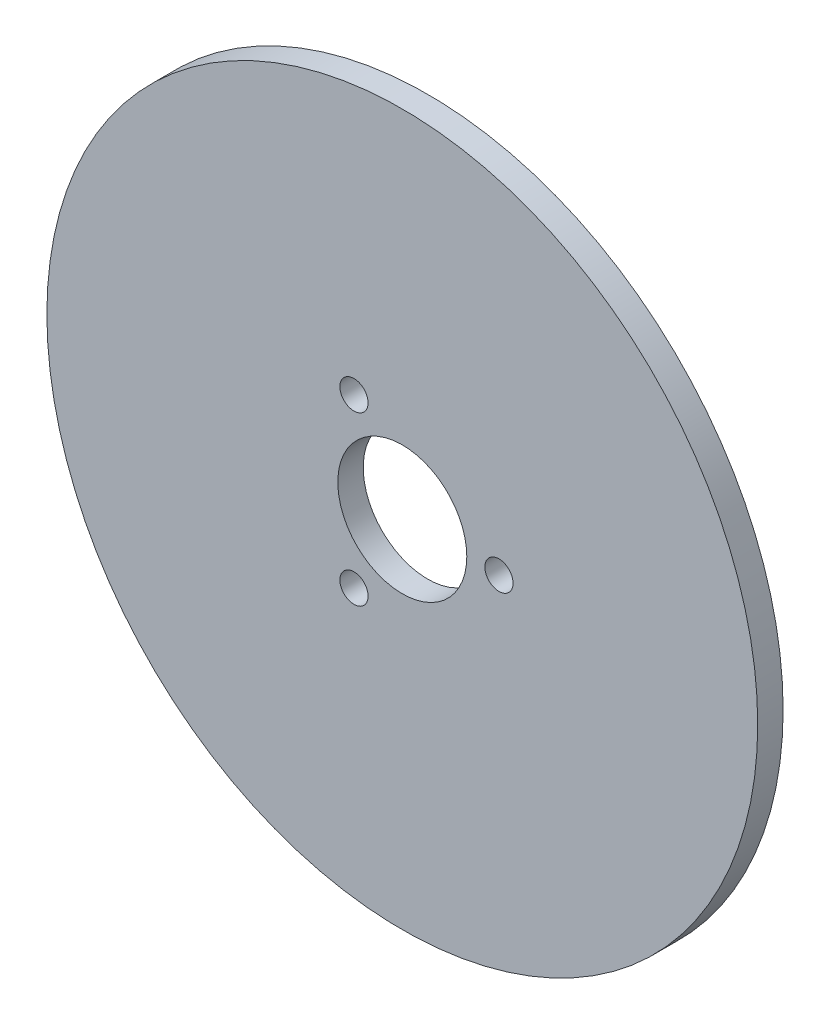
ISO-10303-21;
HEADER;
FILE_DESCRIPTION(('STEP AP214'),'2;1');
FILE_NAME('part.step','',(''),(''),'','','');
FILE_SCHEMA(('AUTOMOTIVE_DESIGN { 1 0 10303 214 1 1 1 1 }'));
ENDSEC;
DATA;
#1=APPLICATION_CONTEXT('core data for automotive mechanical design processes');
#2=APPLICATION_PROTOCOL_DEFINITION('international standard','automotive_design',2000,#1);
#3=PRODUCT_CONTEXT('',#1,'mechanical');
#4=PRODUCT('Part','Part','',(#3));
#5=PRODUCT_RELATED_PRODUCT_CATEGORY('part','',(#4));
#6=PRODUCT_DEFINITION_FORMATION('','',#4);
#7=PRODUCT_DEFINITION_CONTEXT('part definition',#1,'design');
#8=PRODUCT_DEFINITION('design','',#6,#7);
#9=PRODUCT_DEFINITION_SHAPE('','',#8);
#10=(LENGTH_UNIT() NAMED_UNIT(*) SI_UNIT(.MILLI.,.METRE.));
#11=(NAMED_UNIT(*) PLANE_ANGLE_UNIT() SI_UNIT($,.RADIAN.));
#12=(NAMED_UNIT(*) SI_UNIT($,.STERADIAN.) SOLID_ANGLE_UNIT());
#13=UNCERTAINTY_MEASURE_WITH_UNIT(LENGTH_MEASURE(1.E-05),#10,'distance_accuracy_value','');
#14=(GEOMETRIC_REPRESENTATION_CONTEXT(3) GLOBAL_UNCERTAINTY_ASSIGNED_CONTEXT((#13)) GLOBAL_UNIT_ASSIGNED_CONTEXT((#10,
#11,#12)) REPRESENTATION_CONTEXT('',''));
#15=CARTESIAN_POINT('',(0.,0.,0.));
#16=DIRECTION('',(0.,0.,1.));
#17=DIRECTION('',(1.,0.,0.));
#18=AXIS2_PLACEMENT_3D('',#15,#16,#17);
#19=CARTESIAN_POINT('',(0.,0.,5.));
#20=DIRECTION('',(0.,0.,1.));
#21=DIRECTION('',(1.,0.,0.));
#22=AXIS2_PLACEMENT_3D('',#19,#20,#21);
#23=PLANE('',#22);
#24=CARTESIAN_POINT('',(-9.5170625,16.4840357888085,5.));
#25=DIRECTION('',(0.,0.,1.));
#26=DIRECTION('',(1.,0.,0.));
#27=AXIS2_PLACEMENT_3D('',#24,#25,#26);
#28=CIRCLE('',#27,2.778125);
#29=CARTESIAN_POINT('',(-6.7389375,16.4840357888085,5.));
#30=VERTEX_POINT('',#29);
#31=EDGE_CURVE('E86',#30,#30,#28,.T.);
#32=ORIENTED_EDGE('',*,*,#31,.F.);
#33=EDGE_LOOP('',(#32));
#34=FACE_BOUND('',#33,.T.);
#35=CARTESIAN_POINT('',(19.034125,0.,5.));
#36=DIRECTION('',(0.,0.,1.));
#37=DIRECTION('',(1.,0.,0.));
#38=AXIS2_PLACEMENT_3D('',#35,#36,#37);
#39=CIRCLE('',#38,2.778125);
#40=CARTESIAN_POINT('',(21.81225,0.,5.));
#41=VERTEX_POINT('',#40);
#42=EDGE_CURVE('E82',#41,#41,#39,.T.);
#43=ORIENTED_EDGE('',*,*,#42,.F.);
#44=EDGE_LOOP('',(#43));
#45=FACE_BOUND('',#44,.T.);
#46=CARTESIAN_POINT('',(-9.51706249999999,-16.4840357888085,5.));
#47=DIRECTION('',(0.,0.,1.));
#48=DIRECTION('',(1.,0.,0.));
#49=AXIS2_PLACEMENT_3D('',#46,#47,#48);
#50=CIRCLE('',#49,2.778125);
#51=CARTESIAN_POINT('',(-6.73893749999999,-16.4840357888085,5.));
#52=VERTEX_POINT('',#51);
#53=EDGE_CURVE('E74',#52,#52,#50,.T.);
#54=ORIENTED_EDGE('',*,*,#53,.F.);
#55=EDGE_LOOP('',(#54));
#56=FACE_BOUND('',#55,.T.);
#57=CARTESIAN_POINT('',(0.,0.,5.));
#58=DIRECTION('',(0.,0.,1.));
#59=DIRECTION('',(1.,0.,0.));
#60=AXIS2_PLACEMENT_3D('',#57,#58,#59);
#61=CIRCLE('',#60,70.);
#62=CARTESIAN_POINT('',(70.,0.,5.));
#63=VERTEX_POINT('',#62);
#64=EDGE_CURVE('E10',#63,#63,#61,.T.);
#65=ORIENTED_EDGE('',*,*,#64,.T.);
#66=EDGE_LOOP('',(#65));
#67=FACE_BOUND('',#66,.T.);
#68=CARTESIAN_POINT('',(0.,0.,5.));
#69=DIRECTION('',(0.,0.,1.));
#70=DIRECTION('',(1.,0.,0.));
#71=AXIS2_PLACEMENT_3D('',#68,#69,#70);
#72=CIRCLE('',#71,12.7);
#73=CARTESIAN_POINT('',(12.7,0.,5.));
#74=VERTEX_POINT('',#73);
#75=EDGE_CURVE('E60',#74,#74,#72,.T.);
#76=ORIENTED_EDGE('',*,*,#75,.F.);
#77=EDGE_LOOP('',(#76));
#78=FACE_BOUND('',#77,.T.);
#79=ADVANCED_FACE('F47',(#34,#45,#56,#67,#78),#23,.T.);
#80=CARTESIAN_POINT('',(0.,0.,0.));
#81=DIRECTION('',(0.,0.,1.));
#82=DIRECTION('',(1.,0.,0.));
#83=AXIS2_PLACEMENT_3D('',#80,#81,#82);
#84=PLANE('',#83);
#85=CARTESIAN_POINT('',(-9.5170625,16.4840357888085,0.));
#86=DIRECTION('',(0.,0.,1.));
#87=DIRECTION('',(1.,0.,0.));
#88=AXIS2_PLACEMENT_3D('',#85,#86,#87);
#89=CIRCLE('',#88,2.778125);
#90=CARTESIAN_POINT('',(-6.7389375,16.4840357888085,0.));
#91=VERTEX_POINT('',#90);
#92=EDGE_CURVE('E66',#91,#91,#89,.T.);
#93=ORIENTED_EDGE('',*,*,#92,.T.);
#94=EDGE_LOOP('',(#93));
#95=FACE_BOUND('',#94,.T.);
#96=CARTESIAN_POINT('',(19.034125,0.,0.));
#97=DIRECTION('',(0.,0.,1.));
#98=DIRECTION('',(1.,0.,0.));
#99=AXIS2_PLACEMENT_3D('',#96,#97,#98);
#100=CIRCLE('',#99,2.778125);
#101=CARTESIAN_POINT('',(21.81225,0.,0.));
#102=VERTEX_POINT('',#101);
#103=EDGE_CURVE('E78',#102,#102,#100,.T.);
#104=ORIENTED_EDGE('',*,*,#103,.T.);
#105=EDGE_LOOP('',(#104));
#106=FACE_BOUND('',#105,.T.);
#107=CARTESIAN_POINT('',(-9.51706249999999,-16.4840357888085,0.));
#108=DIRECTION('',(0.,0.,1.));
#109=DIRECTION('',(1.,0.,0.));
#110=AXIS2_PLACEMENT_3D('',#107,#108,#109);
#111=CIRCLE('',#110,2.778125);
#112=CARTESIAN_POINT('',(-6.73893749999999,-16.4840357888085,0.));
#113=VERTEX_POINT('',#112);
#114=EDGE_CURVE('E70',#113,#113,#111,.T.);
#115=ORIENTED_EDGE('',*,*,#114,.T.);
#116=EDGE_LOOP('',(#115));
#117=FACE_BOUND('',#116,.T.);
#118=CARTESIAN_POINT('',(0.,0.,0.));
#119=DIRECTION('',(0.,0.,1.));
#120=DIRECTION('',(1.,0.,0.));
#121=AXIS2_PLACEMENT_3D('',#118,#119,#120);
#122=CIRCLE('',#121,70.);
#123=CARTESIAN_POINT('',(70.,0.,0.));
#124=VERTEX_POINT('',#123);
#125=EDGE_CURVE('E51',#124,#124,#122,.T.);
#126=ORIENTED_EDGE('',*,*,#125,.F.);
#127=EDGE_LOOP('',(#126));
#128=FACE_BOUND('',#127,.T.);
#129=CARTESIAN_POINT('',(0.,0.,0.));
#130=DIRECTION('',(0.,0.,1.));
#131=DIRECTION('',(1.,0.,0.));
#132=AXIS2_PLACEMENT_3D('',#129,#130,#131);
#133=CIRCLE('',#132,12.7);
#134=CARTESIAN_POINT('',(12.7,0.,0.));
#135=VERTEX_POINT('',#134);
#136=EDGE_CURVE('E62',#135,#135,#133,.T.);
#137=ORIENTED_EDGE('',*,*,#136,.T.);
#138=EDGE_LOOP('',(#137));
#139=FACE_BOUND('',#138,.T.);
#140=ADVANCED_FACE('F94',(#95,#106,#117,#128,#139),#84,.F.);
#141=CARTESIAN_POINT('',(0.,0.,5.));
#142=DIRECTION('',(0.,0.,-1.));
#143=DIRECTION('',(-1.,0.,0.));
#144=AXIS2_PLACEMENT_3D('',#141,#142,#143);
#145=CYLINDRICAL_SURFACE('',#144,70.);
#146=ORIENTED_EDGE('',*,*,#64,.F.);
#147=EDGE_LOOP('',(#146));
#148=FACE_BOUND('',#147,.T.);
#149=ORIENTED_EDGE('',*,*,#125,.T.);
#150=EDGE_LOOP('',(#149));
#151=FACE_BOUND('',#150,.T.);
#152=ADVANCED_FACE('F49',(#148,#151),#145,.T.);
#153=CARTESIAN_POINT('',(0.,0.,5.));
#154=DIRECTION('',(0.,0.,-1.));
#155=DIRECTION('',(-1.,0.,0.));
#156=AXIS2_PLACEMENT_3D('',#153,#154,#155);
#157=CYLINDRICAL_SURFACE('',#156,12.7);
#158=ORIENTED_EDGE('',*,*,#75,.T.);
#159=EDGE_LOOP('',(#158));
#160=FACE_BOUND('',#159,.T.);
#161=ORIENTED_EDGE('',*,*,#136,.F.);
#162=EDGE_LOOP('',(#161));
#163=FACE_BOUND('',#162,.T.);
#164=ADVANCED_FACE('F113',(#160,#163),#157,.F.);
#165=CARTESIAN_POINT('',(-9.51706249999999,-16.4840357888085,0.));
#166=DIRECTION('',(0.,0.,1.));
#167=DIRECTION('',(1.,0.,0.));
#168=AXIS2_PLACEMENT_3D('',#165,#166,#167);
#169=CYLINDRICAL_SURFACE('',#168,2.778125);
#170=ORIENTED_EDGE('',*,*,#114,.F.);
#171=EDGE_LOOP('',(#170));
#172=FACE_BOUND('',#171,.T.);
#173=ORIENTED_EDGE('',*,*,#53,.T.);
#174=EDGE_LOOP('',(#173));
#175=FACE_BOUND('',#174,.T.);
#176=ADVANCED_FACE('F116',(#172,#175),#169,.F.);
#177=CARTESIAN_POINT('',(19.034125,0.,0.));
#178=DIRECTION('',(0.,0.,1.));
#179=DIRECTION('',(1.,0.,0.));
#180=AXIS2_PLACEMENT_3D('',#177,#178,#179);
#181=CYLINDRICAL_SURFACE('',#180,2.778125);
#182=ORIENTED_EDGE('',*,*,#103,.F.);
#183=EDGE_LOOP('',(#182));
#184=FACE_BOUND('',#183,.T.);
#185=ORIENTED_EDGE('',*,*,#42,.T.);
#186=EDGE_LOOP('',(#185));
#187=FACE_BOUND('',#186,.T.);
#188=ADVANCED_FACE('F100',(#184,#187),#181,.F.);
#189=CARTESIAN_POINT('',(-9.5170625,16.4840357888085,0.));
#190=DIRECTION('',(0.,0.,1.));
#191=DIRECTION('',(1.,0.,0.));
#192=AXIS2_PLACEMENT_3D('',#189,#190,#191);
#193=CYLINDRICAL_SURFACE('',#192,2.778125);
#194=ORIENTED_EDGE('',*,*,#92,.F.);
#195=EDGE_LOOP('',(#194));
#196=FACE_BOUND('',#195,.T.);
#197=ORIENTED_EDGE('',*,*,#31,.T.);
#198=EDGE_LOOP('',(#197));
#199=FACE_BOUND('',#198,.T.);
#200=ADVANCED_FACE('F97',(#196,#199),#193,.F.);
#201=CLOSED_SHELL('',(#79,#140,#152,#164,#176,#188,#200));
#202=MANIFOLD_SOLID_BREP('B2',#201);
#203=ADVANCED_BREP_SHAPE_REPRESENTATION('',(#18,#202),#14);
#204=SHAPE_DEFINITION_REPRESENTATION(#9,#203);
ENDSEC;
END-ISO-10303-21;
